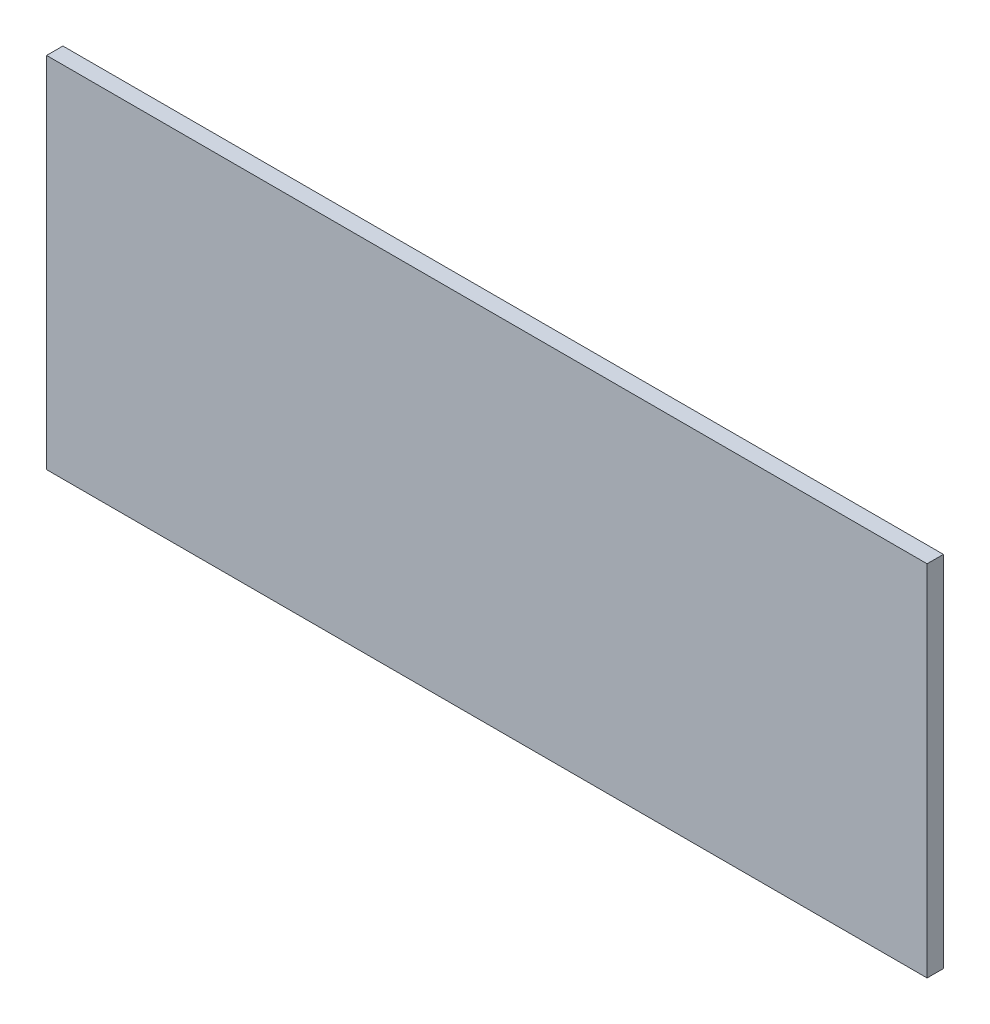
ISO-10303-21;
HEADER;
FILE_DESCRIPTION(('STEP AP214'),'2;1');
FILE_NAME('part.step','',(''),(''),'','','');
FILE_SCHEMA(('AUTOMOTIVE_DESIGN { 1 0 10303 214 1 1 1 1 }'));
ENDSEC;
DATA;
#1=APPLICATION_CONTEXT('core data for automotive mechanical design processes');
#2=APPLICATION_PROTOCOL_DEFINITION('international standard','automotive_design',2000,#1);
#3=PRODUCT_CONTEXT('',#1,'mechanical');
#4=PRODUCT('Part','Part','',(#3));
#5=PRODUCT_RELATED_PRODUCT_CATEGORY('part','',(#4));
#6=PRODUCT_DEFINITION_FORMATION('','',#4);
#7=PRODUCT_DEFINITION_CONTEXT('part definition',#1,'design');
#8=PRODUCT_DEFINITION('design','',#6,#7);
#9=PRODUCT_DEFINITION_SHAPE('','',#8);
#10=(LENGTH_UNIT() NAMED_UNIT(*) SI_UNIT(.MILLI.,.METRE.));
#11=(NAMED_UNIT(*) PLANE_ANGLE_UNIT() SI_UNIT($,.RADIAN.));
#12=(NAMED_UNIT(*) SI_UNIT($,.STERADIAN.) SOLID_ANGLE_UNIT());
#13=UNCERTAINTY_MEASURE_WITH_UNIT(LENGTH_MEASURE(1.E-05),#10,'distance_accuracy_value','');
#14=(GEOMETRIC_REPRESENTATION_CONTEXT(3) GLOBAL_UNCERTAINTY_ASSIGNED_CONTEXT((#13)) GLOBAL_UNIT_ASSIGNED_CONTEXT((#10,
#11,#12)) REPRESENTATION_CONTEXT('',''));
#15=CARTESIAN_POINT('',(0.,0.,0.));
#16=DIRECTION('',(0.,0.,1.));
#17=DIRECTION('',(1.,0.,0.));
#18=AXIS2_PLACEMENT_3D('',#15,#16,#17);
#19=CARTESIAN_POINT('',(0.,0.,5.));
#20=DIRECTION('',(-1.,0.,0.));
#21=DIRECTION('',(0.,0.,1.));
#22=AXIS2_PLACEMENT_3D('',#19,#20,#21);
#23=PLANE('',#22);
#24=DIRECTION('',(0.,1.,0.));
#25=VECTOR('',#24,1.);
#26=CARTESIAN_POINT('',(0.,0.,0.));
#27=LINE('',#26,#25);
#28=CARTESIAN_POINT('',(0.,0.,0.));
#29=VERTEX_POINT('',#28);
#30=CARTESIAN_POINT('',(0.,110.,0.));
#31=VERTEX_POINT('',#30);
#32=EDGE_CURVE('E111',#29,#31,#27,.T.);
#33=ORIENTED_EDGE('',*,*,#32,.T.);
#34=DIRECTION('',(0.,0.,-1.));
#35=VECTOR('',#34,1.);
#36=CARTESIAN_POINT('',(0.,110.,5.));
#37=LINE('',#36,#35);
#38=CARTESIAN_POINT('',(0.,110.,5.));
#39=VERTEX_POINT('',#38);
#40=EDGE_CURVE('E11',#39,#31,#37,.T.);
#41=ORIENTED_EDGE('',*,*,#40,.F.);
#42=DIRECTION('',(0.,1.,0.));
#43=VECTOR('',#42,1.);
#44=CARTESIAN_POINT('',(0.,0.,5.));
#45=LINE('',#44,#43);
#46=CARTESIAN_POINT('',(0.,0.,5.));
#47=VERTEX_POINT('',#46);
#48=EDGE_CURVE('E94',#47,#39,#45,.T.);
#49=ORIENTED_EDGE('',*,*,#48,.F.);
#50=DIRECTION('',(0.,0.,-1.));
#51=VECTOR('',#50,1.);
#52=CARTESIAN_POINT('',(0.,0.,5.));
#53=LINE('',#52,#51);
#54=EDGE_CURVE('E62',#47,#29,#53,.T.);
#55=ORIENTED_EDGE('',*,*,#54,.T.);
#56=EDGE_LOOP('',(#33,#41,#49,#55));
#57=FACE_BOUND('',#56,.T.);
#58=ADVANCED_FACE('F44',(#57),#23,.F.);
#59=CARTESIAN_POINT('',(0.,110.,5.));
#60=DIRECTION('',(0.,-1.,0.));
#61=DIRECTION('',(0.,0.,-1.));
#62=AXIS2_PLACEMENT_3D('',#59,#60,#61);
#63=PLANE('',#62);
#64=DIRECTION('',(-1.,0.,0.));
#65=VECTOR('',#64,1.);
#66=CARTESIAN_POINT('',(0.,110.,0.));
#67=LINE('',#66,#65);
#68=CARTESIAN_POINT('',(-270.,110.,0.));
#69=VERTEX_POINT('',#68);
#70=EDGE_CURVE('E102',#31,#69,#67,.T.);
#71=ORIENTED_EDGE('',*,*,#70,.T.);
#72=DIRECTION('',(0.,0.,-1.));
#73=VECTOR('',#72,1.);
#74=CARTESIAN_POINT('',(-270.,110.,5.));
#75=LINE('',#74,#73);
#76=CARTESIAN_POINT('',(-270.,110.,5.));
#77=VERTEX_POINT('',#76);
#78=EDGE_CURVE('E53',#77,#69,#75,.T.);
#79=ORIENTED_EDGE('',*,*,#78,.F.);
#80=DIRECTION('',(-1.,0.,0.));
#81=VECTOR('',#80,1.);
#82=CARTESIAN_POINT('',(0.,110.,5.));
#83=LINE('',#82,#81);
#84=EDGE_CURVE('E90',#39,#77,#83,.T.);
#85=ORIENTED_EDGE('',*,*,#84,.F.);
#86=ORIENTED_EDGE('',*,*,#40,.T.);
#87=EDGE_LOOP('',(#71,#79,#85,#86));
#88=FACE_BOUND('',#87,.T.);
#89=ADVANCED_FACE('F99',(#88),#63,.F.);
#90=CARTESIAN_POINT('',(-270.,0.,5.));
#91=DIRECTION('',(-1.,0.,0.));
#92=DIRECTION('',(0.,-1.,0.));
#93=AXIS2_PLACEMENT_3D('',#90,#91,#92);
#94=PLANE('',#93);
#95=DIRECTION('',(0.,1.,0.));
#96=VECTOR('',#95,1.);
#97=CARTESIAN_POINT('',(-270.,0.,0.));
#98=LINE('',#97,#96);
#99=CARTESIAN_POINT('',(-270.,0.,0.));
#100=VERTEX_POINT('',#99);
#101=EDGE_CURVE('E119',#100,#69,#98,.T.);
#102=ORIENTED_EDGE('',*,*,#101,.F.);
#103=DIRECTION('',(0.,0.,-1.));
#104=VECTOR('',#103,1.);
#105=CARTESIAN_POINT('',(-270.,0.,5.));
#106=LINE('',#105,#104);
#107=CARTESIAN_POINT('',(-270.,0.,5.));
#108=VERTEX_POINT('',#107);
#109=EDGE_CURVE('E78',#108,#100,#106,.T.);
#110=ORIENTED_EDGE('',*,*,#109,.F.);
#111=DIRECTION('',(0.,1.,0.));
#112=VECTOR('',#111,1.);
#113=CARTESIAN_POINT('',(-270.,0.,5.));
#114=LINE('',#113,#112);
#115=EDGE_CURVE('E92',#108,#77,#114,.T.);
#116=ORIENTED_EDGE('',*,*,#115,.T.);
#117=ORIENTED_EDGE('',*,*,#78,.T.);
#118=EDGE_LOOP('',(#102,#110,#116,#117));
#119=FACE_BOUND('',#118,.T.);
#120=ADVANCED_FACE('F103',(#119),#94,.T.);
#121=CARTESIAN_POINT('',(0.,0.,5.));
#122=DIRECTION('',(0.,-1.,0.));
#123=DIRECTION('',(0.,0.,-1.));
#124=AXIS2_PLACEMENT_3D('',#121,#122,#123);
#125=PLANE('',#124);
#126=DIRECTION('',(-1.,0.,0.));
#127=VECTOR('',#126,1.);
#128=CARTESIAN_POINT('',(0.,0.,0.));
#129=LINE('',#128,#127);
#130=EDGE_CURVE('E123',#29,#100,#129,.T.);
#131=ORIENTED_EDGE('',*,*,#130,.F.);
#132=ORIENTED_EDGE('',*,*,#54,.F.);
#133=DIRECTION('',(-1.,0.,0.));
#134=VECTOR('',#133,1.);
#135=CARTESIAN_POINT('',(0.,0.,5.));
#136=LINE('',#135,#134);
#137=EDGE_CURVE('E107',#47,#108,#136,.T.);
#138=ORIENTED_EDGE('',*,*,#137,.T.);
#139=ORIENTED_EDGE('',*,*,#109,.T.);
#140=EDGE_LOOP('',(#131,#132,#138,#139));
#141=FACE_BOUND('',#140,.T.);
#142=ADVANCED_FACE('F131',(#141),#125,.T.);
#143=CARTESIAN_POINT('',(0.,0.,5.));
#144=DIRECTION('',(0.,0.,1.));
#145=DIRECTION('',(1.,0.,0.));
#146=AXIS2_PLACEMENT_3D('',#143,#144,#145);
#147=PLANE('',#146);
#148=ORIENTED_EDGE('',*,*,#48,.T.);
#149=ORIENTED_EDGE('',*,*,#84,.T.);
#150=ORIENTED_EDGE('',*,*,#115,.F.);
#151=ORIENTED_EDGE('',*,*,#137,.F.);
#152=EDGE_LOOP('',(#148,#149,#150,#151));
#153=FACE_BOUND('',#152,.T.);
#154=ADVANCED_FACE('F91',(#153),#147,.T.);
#155=CARTESIAN_POINT('',(0.,0.,0.));
#156=DIRECTION('',(0.,0.,1.));
#157=DIRECTION('',(1.,0.,0.));
#158=AXIS2_PLACEMENT_3D('',#155,#156,#157);
#159=PLANE('',#158);
#160=ORIENTED_EDGE('',*,*,#32,.F.);
#161=ORIENTED_EDGE('',*,*,#130,.T.);
#162=ORIENTED_EDGE('',*,*,#101,.T.);
#163=ORIENTED_EDGE('',*,*,#70,.F.);
#164=EDGE_LOOP('',(#160,#161,#162,#163));
#165=FACE_BOUND('',#164,.T.);
#166=ADVANCED_FACE('F127',(#165),#159,.F.);
#167=CLOSED_SHELL('',(#58,#89,#120,#142,#154,#166));
#168=MANIFOLD_SOLID_BREP('B2',#167);
#169=ADVANCED_BREP_SHAPE_REPRESENTATION('',(#18,#168),#14);
#170=SHAPE_DEFINITION_REPRESENTATION(#9,#169);
ENDSEC;
END-ISO-10303-21;
